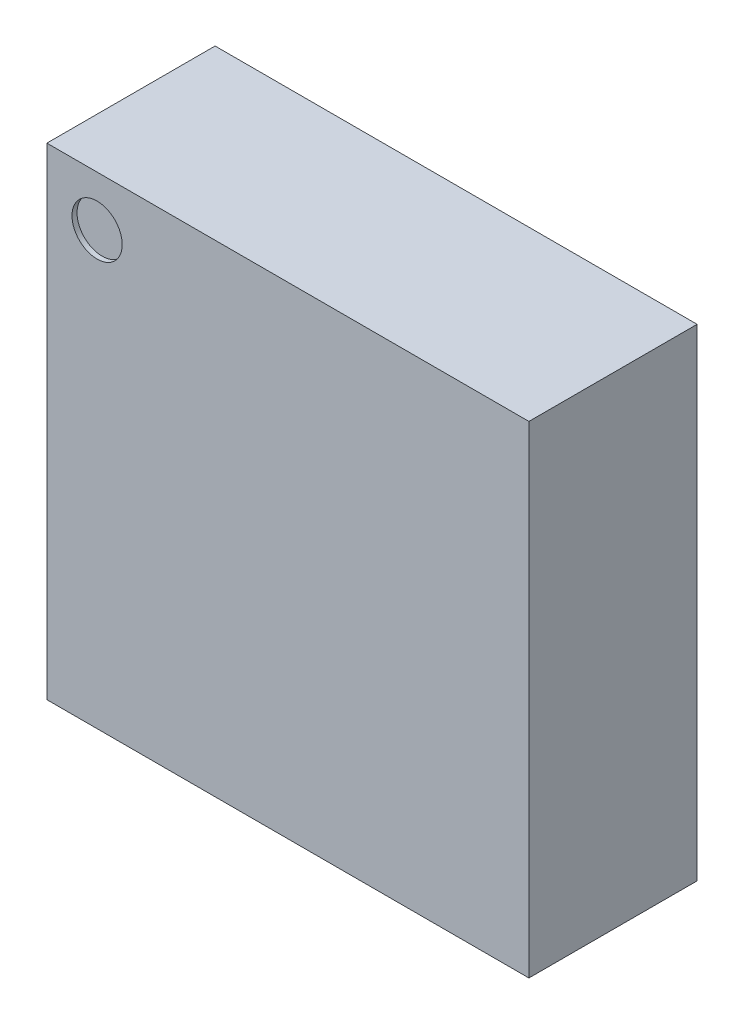
ISO-10303-21;
HEADER;
FILE_DESCRIPTION(('STEP AP214'),'2;1');
FILE_NAME('part.step','',(''),(''),'','','');
FILE_SCHEMA(('AUTOMOTIVE_DESIGN { 1 0 10303 214 1 1 1 1 }'));
ENDSEC;
DATA;
#1=APPLICATION_CONTEXT('core data for automotive mechanical design processes');
#2=APPLICATION_PROTOCOL_DEFINITION('international standard','automotive_design',2000,#1);
#3=PRODUCT_CONTEXT('',#1,'mechanical');
#4=PRODUCT('Part','Part','',(#3));
#5=PRODUCT_RELATED_PRODUCT_CATEGORY('part','',(#4));
#6=PRODUCT_DEFINITION_FORMATION('','',#4);
#7=PRODUCT_DEFINITION_CONTEXT('part definition',#1,'design');
#8=PRODUCT_DEFINITION('design','',#6,#7);
#9=PRODUCT_DEFINITION_SHAPE('','',#8);
#10=(LENGTH_UNIT() NAMED_UNIT(*) SI_UNIT(.MILLI.,.METRE.));
#11=(NAMED_UNIT(*) PLANE_ANGLE_UNIT() SI_UNIT($,.RADIAN.));
#12=(NAMED_UNIT(*) SI_UNIT($,.STERADIAN.) SOLID_ANGLE_UNIT());
#13=UNCERTAINTY_MEASURE_WITH_UNIT(LENGTH_MEASURE(1.E-05),#10,'distance_accuracy_value','');
#14=(GEOMETRIC_REPRESENTATION_CONTEXT(3) GLOBAL_UNCERTAINTY_ASSIGNED_CONTEXT((#13)) GLOBAL_UNIT_ASSIGNED_CONTEXT((#10,
#11,#12)) REPRESENTATION_CONTEXT('',''));
#15=CARTESIAN_POINT('',(0.,0.,0.));
#16=DIRECTION('',(0.,0.,1.));
#17=DIRECTION('',(1.,0.,0.));
#18=AXIS2_PLACEMENT_3D('',#15,#16,#17);
#19=CARTESIAN_POINT('',(0.,-0.48000000000062,0.512499999999982));
#20=DIRECTION('',(0.,0.,1.));
#21=DIRECTION('',(1.,0.,0.));
#22=AXIS2_PLACEMENT_3D('',#19,#20,#21);
#23=PLANE('',#22);
#24=CARTESIAN_POINT('',(-0.380000000000004,0.380000000000512,0.512499999999982));
#25=DIRECTION('',(0.,0.,1.));
#26=DIRECTION('',(1.,0.,0.));
#27=AXIS2_PLACEMENT_3D('',#24,#25,#26);
#28=CIRCLE('',#27,0.0500000000000032);
#29=CARTESIAN_POINT('',(-0.330000000000001,0.380000000000512,0.512499999999982));
#30=VERTEX_POINT('',#29);
#31=EDGE_CURVE('E20',#30,#30,#28,.T.);
#32=ORIENTED_EDGE('',*,*,#31,.T.);
#33=EDGE_LOOP('',(#32));
#34=FACE_BOUND('',#33,.T.);
#35=ADVANCED_FACE('F17',(#34),#23,.T.);
#36=CARTESIAN_POINT('',(-0.380000000000004,0.380000000000512,0.522499999999942));
#37=DIRECTION('',(0.,0.,1.));
#38=DIRECTION('',(1.,0.,0.));
#39=AXIS2_PLACEMENT_3D('',#36,#37,#38);
#40=CYLINDRICAL_SURFACE('',#39,0.0500000000000032);
#41=ORIENTED_EDGE('',*,*,#31,.F.);
#42=EDGE_LOOP('',(#41));
#43=FACE_BOUND('',#42,.T.);
#44=CARTESIAN_POINT('',(-0.380000000000004,0.380000000000512,0.522499999999942));
#45=DIRECTION('',(0.,0.,1.));
#46=DIRECTION('',(1.,0.,0.));
#47=AXIS2_PLACEMENT_3D('',#44,#45,#46);
#48=CIRCLE('',#47,0.0500000000000032);
#49=CARTESIAN_POINT('',(-0.330000000000001,0.380000000000512,0.522499999999942));
#50=VERTEX_POINT('',#49);
#51=EDGE_CURVE('E69',#50,#50,#48,.F.);
#52=ORIENTED_EDGE('',*,*,#51,.F.);
#53=EDGE_LOOP('',(#52));
#54=FACE_BOUND('',#53,.T.);
#55=ADVANCED_FACE('F89',(#43,#54),#40,.F.);
#56=CARTESIAN_POINT('',(-0.480000000000112,-0.48000000000062,0.522499999999942));
#57=DIRECTION('',(0.,0.,1.));
#58=DIRECTION('',(1.,0.,0.));
#59=AXIS2_PLACEMENT_3D('',#56,#57,#58);
#60=PLANE('',#59);
#61=ORIENTED_EDGE('',*,*,#51,.T.);
#62=EDGE_LOOP('',(#61));
#63=FACE_BOUND('',#62,.T.);
#64=DIRECTION('',(0.,1.,0.));
#65=VECTOR('',#64,1.);
#66=CARTESIAN_POINT('',(-0.480000000000112,-0.48000000000062,0.522499999999942));
#67=LINE('',#66,#65);
#68=CARTESIAN_POINT('',(-0.480000000000112,-0.48000000000062,0.522499999999942));
#69=VERTEX_POINT('',#68);
#70=CARTESIAN_POINT('',(-0.480000000000112,0.48000000000062,0.522499999999942));
#71=VERTEX_POINT('',#70);
#72=EDGE_CURVE('E60',#69,#71,#67,.T.);
#73=ORIENTED_EDGE('',*,*,#72,.F.);
#74=DIRECTION('',(1.,0.,0.));
#75=VECTOR('',#74,1.);
#76=CARTESIAN_POINT('',(0.,-0.48000000000062,0.522499999999942));
#77=LINE('',#76,#75);
#78=CARTESIAN_POINT('',(0.480000000000112,-0.48000000000062,0.522499999999942));
#79=VERTEX_POINT('',#78);
#80=EDGE_CURVE('E197',#69,#79,#77,.T.);
#81=ORIENTED_EDGE('',*,*,#80,.T.);
#82=DIRECTION('',(0.,1.,0.));
#83=VECTOR('',#82,1.);
#84=CARTESIAN_POINT('',(0.480000000000112,-0.48000000000062,0.522499999999942));
#85=LINE('',#84,#83);
#86=CARTESIAN_POINT('',(0.480000000000112,0.48000000000062,0.522499999999942));
#87=VERTEX_POINT('',#86);
#88=EDGE_CURVE('E72',#87,#79,#85,.F.);
#89=ORIENTED_EDGE('',*,*,#88,.F.);
#90=DIRECTION('',(1.,0.,0.));
#91=VECTOR('',#90,1.);
#92=CARTESIAN_POINT('',(0.,0.48000000000062,0.522499999999942));
#93=LINE('',#92,#91);
#94=EDGE_CURVE('E55',#71,#87,#93,.T.);
#95=ORIENTED_EDGE('',*,*,#94,.F.);
#96=EDGE_LOOP('',(#73,#81,#89,#95));
#97=FACE_BOUND('',#96,.T.);
#98=ADVANCED_FACE('F71',(#63,#97),#60,.T.);
#99=CARTESIAN_POINT('',(-0.480000000000112,-0.48000000000062,0.187500000000012));
#100=DIRECTION('',(-1.,0.,0.));
#101=DIRECTION('',(0.,0.,1.));
#102=AXIS2_PLACEMENT_3D('',#99,#100,#101);
#103=PLANE('',#102);
#104=DIRECTION('',(0.,1.,0.));
#105=VECTOR('',#104,1.);
#106=CARTESIAN_POINT('',(-0.480000000000112,-0.48000000000062,0.187500000000012));
#107=LINE('',#106,#105);
#108=CARTESIAN_POINT('',(-0.480000000000112,-0.48000000000062,0.187500000000012));
#109=VERTEX_POINT('',#108);
#110=CARTESIAN_POINT('',(-0.480000000000112,0.48000000000062,0.187500000000012));
#111=VERTEX_POINT('',#110);
#112=EDGE_CURVE('E198',#109,#111,#107,.T.);
#113=ORIENTED_EDGE('',*,*,#112,.F.);
#114=DIRECTION('',(0.,0.,1.));
#115=VECTOR('',#114,1.);
#116=CARTESIAN_POINT('',(-0.480000000000112,-0.48000000000062,0.));
#117=LINE('',#116,#115);
#118=EDGE_CURVE('E65',#109,#69,#117,.T.);
#119=ORIENTED_EDGE('',*,*,#118,.T.);
#120=ORIENTED_EDGE('',*,*,#72,.T.);
#121=DIRECTION('',(0.,0.,1.));
#122=VECTOR('',#121,1.);
#123=CARTESIAN_POINT('',(-0.480000000000112,0.48000000000062,0.));
#124=LINE('',#123,#122);
#125=EDGE_CURVE('E62',#111,#71,#124,.T.);
#126=ORIENTED_EDGE('',*,*,#125,.F.);
#127=EDGE_LOOP('',(#113,#119,#120,#126));
#128=FACE_BOUND('',#127,.T.);
#129=ADVANCED_FACE('F61',(#128),#103,.T.);
#130=CARTESIAN_POINT('',(0.,0.48000000000062,0.));
#131=DIRECTION('',(0.,1.,0.));
#132=DIRECTION('',(0.,0.,1.));
#133=AXIS2_PLACEMENT_3D('',#130,#131,#132);
#134=PLANE('',#133);
#135=ORIENTED_EDGE('',*,*,#94,.T.);
#136=DIRECTION('',(0.,0.,-1.));
#137=VECTOR('',#136,1.);
#138=CARTESIAN_POINT('',(0.480000000000112,0.48000000000062,0.522499999999942));
#139=LINE('',#138,#137);
#140=CARTESIAN_POINT('',(0.480000000000112,0.48000000000062,0.187500000000012));
#141=VERTEX_POINT('',#140);
#142=EDGE_CURVE('E74',#141,#87,#139,.F.);
#143=ORIENTED_EDGE('',*,*,#142,.F.);
#144=DIRECTION('',(-1.,0.,0.));
#145=VECTOR('',#144,1.);
#146=CARTESIAN_POINT('',(0.480000000000112,0.48000000000062,0.187500000000012));
#147=LINE('',#146,#145);
#148=EDGE_CURVE('E78',#111,#141,#147,.F.);
#149=ORIENTED_EDGE('',*,*,#148,.F.);
#150=ORIENTED_EDGE('',*,*,#125,.T.);
#151=EDGE_LOOP('',(#135,#143,#149,#150));
#152=FACE_BOUND('',#151,.T.);
#153=ADVANCED_FACE('F76',(#152),#134,.T.);
#154=CARTESIAN_POINT('',(0.480000000000112,-0.48000000000062,0.522499999999942));
#155=DIRECTION('',(1.,0.,0.));
#156=DIRECTION('',(0.,0.,-1.));
#157=AXIS2_PLACEMENT_3D('',#154,#155,#156);
#158=PLANE('',#157);
#159=ORIENTED_EDGE('',*,*,#88,.T.);
#160=DIRECTION('',(0.,0.,1.));
#161=VECTOR('',#160,1.);
#162=CARTESIAN_POINT('',(0.480000000000112,-0.48000000000062,0.));
#163=LINE('',#162,#161);
#164=CARTESIAN_POINT('',(0.480000000000112,-0.48000000000062,0.187500000000012));
#165=VERTEX_POINT('',#164);
#166=EDGE_CURVE('E35',#79,#165,#163,.F.);
#167=ORIENTED_EDGE('',*,*,#166,.T.);
#168=DIRECTION('',(0.,1.,0.));
#169=VECTOR('',#168,1.);
#170=CARTESIAN_POINT('',(0.480000000000112,-0.48000000000062,0.187500000000012));
#171=LINE('',#170,#169);
#172=EDGE_CURVE('E26',#141,#165,#171,.F.);
#173=ORIENTED_EDGE('',*,*,#172,.F.);
#174=ORIENTED_EDGE('',*,*,#142,.T.);
#175=EDGE_LOOP('',(#159,#167,#173,#174));
#176=FACE_BOUND('',#175,.T.);
#177=ADVANCED_FACE('F106',(#176),#158,.T.);
#178=CARTESIAN_POINT('',(0.,-0.48000000000062,0.));
#179=DIRECTION('',(0.,1.,0.));
#180=DIRECTION('',(0.,0.,1.));
#181=AXIS2_PLACEMENT_3D('',#178,#179,#180);
#182=PLANE('',#181);
#183=ORIENTED_EDGE('',*,*,#118,.F.);
#184=DIRECTION('',(-1.,0.,0.));
#185=VECTOR('',#184,1.);
#186=CARTESIAN_POINT('',(0.480000000000112,-0.48000000000062,0.187500000000012));
#187=LINE('',#186,#185);
#188=EDGE_CURVE('E11',#165,#109,#187,.T.);
#189=ORIENTED_EDGE('',*,*,#188,.F.);
#190=ORIENTED_EDGE('',*,*,#166,.F.);
#191=ORIENTED_EDGE('',*,*,#80,.F.);
#192=EDGE_LOOP('',(#183,#189,#190,#191));
#193=FACE_BOUND('',#192,.T.);
#194=ADVANCED_FACE('F100',(#193),#182,.F.);
#195=CARTESIAN_POINT('',(0.480000000000112,-0.48000000000062,0.187500000000012));
#196=DIRECTION('',(0.,0.,-1.));
#197=DIRECTION('',(-1.,0.,0.));
#198=AXIS2_PLACEMENT_3D('',#195,#196,#197);
#199=PLANE('',#198);
#200=ORIENTED_EDGE('',*,*,#172,.T.);
#201=ORIENTED_EDGE('',*,*,#188,.T.);
#202=ORIENTED_EDGE('',*,*,#112,.T.);
#203=ORIENTED_EDGE('',*,*,#148,.T.);
#204=EDGE_LOOP('',(#200,#201,#202,#203));
#205=FACE_BOUND('',#204,.T.);
#206=ADVANCED_FACE('F98',(#205),#199,.T.);
#207=CLOSED_SHELL('',(#35,#55,#98,#129,#153,#177,#194,#206));
#208=MANIFOLD_SOLID_BREP('B1',#207);
#209=ADVANCED_BREP_SHAPE_REPRESENTATION('',(#18,#208),#14);
#210=SHAPE_DEFINITION_REPRESENTATION(#9,#209);
ENDSEC;
END-ISO-10303-21;
